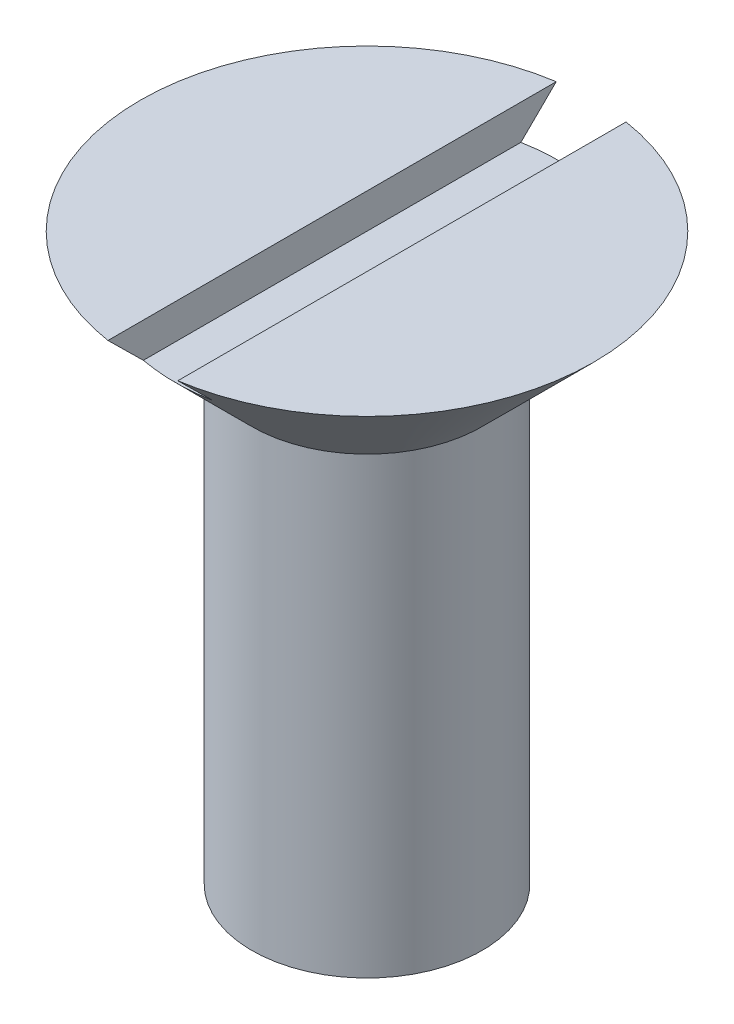
ISO-10303-21;
HEADER;
FILE_DESCRIPTION(('STEP AP214'),'2;1');
FILE_NAME('part.step','',(''),(''),'','','');
FILE_SCHEMA(('AUTOMOTIVE_DESIGN { 1 0 10303 214 1 1 1 1 }'));
ENDSEC;
DATA;
#1=APPLICATION_CONTEXT('core data for automotive mechanical design processes');
#2=APPLICATION_PROTOCOL_DEFINITION('international standard','automotive_design',2000,#1);
#3=PRODUCT_CONTEXT('',#1,'mechanical');
#4=PRODUCT('Part','Part','',(#3));
#5=PRODUCT_RELATED_PRODUCT_CATEGORY('part','',(#4));
#6=PRODUCT_DEFINITION_FORMATION('','',#4);
#7=PRODUCT_DEFINITION_CONTEXT('part definition',#1,'design');
#8=PRODUCT_DEFINITION('design','',#6,#7);
#9=PRODUCT_DEFINITION_SHAPE('','',#8);
#10=(LENGTH_UNIT() NAMED_UNIT(*) SI_UNIT(.MILLI.,.METRE.));
#11=(NAMED_UNIT(*) PLANE_ANGLE_UNIT() SI_UNIT($,.RADIAN.));
#12=(NAMED_UNIT(*) SI_UNIT($,.STERADIAN.) SOLID_ANGLE_UNIT());
#13=UNCERTAINTY_MEASURE_WITH_UNIT(LENGTH_MEASURE(1.E-05),#10,'distance_accuracy_value','');
#14=(GEOMETRIC_REPRESENTATION_CONTEXT(3) GLOBAL_UNCERTAINTY_ASSIGNED_CONTEXT((#13)) GLOBAL_UNIT_ASSIGNED_CONTEXT((#10,
#11,#12)) REPRESENTATION_CONTEXT('',''));
#15=CARTESIAN_POINT('',(0.,0.,0.));
#16=DIRECTION('',(0.,0.,1.));
#17=DIRECTION('',(1.,0.,0.));
#18=AXIS2_PLACEMENT_3D('',#15,#16,#17);
#19=CARTESIAN_POINT('',(-6.5,0.,0.));
#20=DIRECTION('',(0.,1.,0.));
#21=DIRECTION('',(-1.,0.,0.));
#22=AXIS2_PLACEMENT_3D('',#19,#20,#21);
#23=PLANE('',#22);
#24=DIRECTION('',(0.,0.,1.));
#25=VECTOR('',#24,1.);
#26=CARTESIAN_POINT('',(1.,0.,-6.5));
#27=LINE('',#26,#25);
#28=CARTESIAN_POINT('',(1.,0.,-6.42261628933256));
#29=VERTEX_POINT('',#28);
#30=CARTESIAN_POINT('',(1.,0.,6.42261628933256));
#31=VERTEX_POINT('',#30);
#32=EDGE_CURVE('E103',#29,#31,#27,.T.);
#33=ORIENTED_EDGE('',*,*,#32,.T.);
#34=CARTESIAN_POINT('',(0.,0.,0.));
#35=DIRECTION('',(0.,1.,0.));
#36=DIRECTION('',(-1.,0.,0.));
#37=AXIS2_PLACEMENT_3D('',#34,#35,#36);
#38=CIRCLE('',#37,6.5);
#39=EDGE_CURVE('E110',#31,#29,#38,.T.);
#40=ORIENTED_EDGE('',*,*,#39,.T.);
#41=EDGE_LOOP('',(#33,#40));
#42=FACE_BOUND('',#41,.T.);
#43=ADVANCED_FACE('F39',(#42),#23,.T.);
#44=CARTESIAN_POINT('',(0.,0.,0.));
#45=DIRECTION('',(0.,1.,0.));
#46=DIRECTION('',(-1.,0.,0.));
#47=AXIS2_PLACEMENT_3D('',#44,#45,#46);
#48=CYLINDRICAL_SURFACE('',#47,3.30000000000001);
#49=CARTESIAN_POINT('',(0.,-16.2,0.));
#50=DIRECTION('',(0.,1.,0.));
#51=DIRECTION('',(-1.,0.,0.));
#52=AXIS2_PLACEMENT_3D('',#49,#50,#51);
#53=CIRCLE('',#52,3.30000000000001);
#54=CARTESIAN_POINT('',(-3.30000000000001,-16.2,0.));
#55=VERTEX_POINT('',#54);
#56=EDGE_CURVE('E95',#55,#55,#53,.T.);
#57=ORIENTED_EDGE('',*,*,#56,.T.);
#58=EDGE_LOOP('',(#57));
#59=FACE_BOUND('',#58,.T.);
#60=CARTESIAN_POINT('',(0.,-3.2,0.));
#61=DIRECTION('',(0.,1.,0.));
#62=DIRECTION('',(-1.,0.,0.));
#63=AXIS2_PLACEMENT_3D('',#60,#61,#62);
#64=CIRCLE('',#63,3.30000000000001);
#65=CARTESIAN_POINT('',(-3.30000000000001,-3.2,0.));
#66=VERTEX_POINT('',#65);
#67=EDGE_CURVE('E111',#66,#66,#64,.T.);
#68=ORIENTED_EDGE('',*,*,#67,.F.);
#69=EDGE_LOOP('',(#68));
#70=FACE_BOUND('',#69,.T.);
#71=ADVANCED_FACE('F41',(#59,#70),#48,.T.);
#72=CARTESIAN_POINT('',(0.,-16.2,0.));
#73=DIRECTION('',(0.,1.,0.));
#74=DIRECTION('',(-1.,0.,0.));
#75=AXIS2_PLACEMENT_3D('',#72,#73,#74);
#76=CONICAL_SURFACE('',#75,3.30000000000001,1.0471975511966);
#77=CARTESIAN_POINT('',(0.,-18.1052558883257,0.));
#78=VERTEX_POINT('',#77);
#79=VERTEX_LOOP('',#78);
#80=FACE_BOUND('',#79,.T.);
#81=ORIENTED_EDGE('',*,*,#56,.F.);
#82=EDGE_LOOP('',(#81));
#83=FACE_BOUND('',#82,.T.);
#84=ADVANCED_FACE('F148',(#80,#83),#76,.T.);
#85=DIRECTION('',(0.,0.,1.));
#86=VECTOR('',#85,1.);
#87=CARTESIAN_POINT('',(-1.,0.,-6.5));
#88=LINE('',#87,#86);
#89=CARTESIAN_POINT('',(-1.,0.,-6.42261628933256));
#90=VERTEX_POINT('',#89);
#91=CARTESIAN_POINT('',(-1.,0.,6.42261628933256));
#92=VERTEX_POINT('',#91);
#93=EDGE_CURVE('E88',#90,#92,#88,.T.);
#94=ORIENTED_EDGE('',*,*,#93,.F.);
#95=EDGE_CURVE('E101',#90,#92,#38,.T.);
#96=ORIENTED_EDGE('',*,*,#95,.T.);
#97=EDGE_LOOP('',(#94,#96));
#98=FACE_BOUND('',#97,.T.);
#99=ADVANCED_FACE('F100',(#98),#23,.T.);
#100=CARTESIAN_POINT('',(0.,0.,0.));
#101=DIRECTION('',(0.,1.,0.));
#102=DIRECTION('',(-1.,0.,0.));
#103=AXIS2_PLACEMENT_3D('',#100,#101,#102);
#104=CONICAL_SURFACE('',#103,6.5,0.785398163397447);
#105=CARTESIAN_POINT('',(1.,0.000699999999998555,-6.42332472244709));
#106=CARTESIAN_POINT('',(1.,-0.183792492730858,-6.23660097945427));
#107=CARTESIAN_POINT('',(1.,-0.368197265502146,-6.04979042026791));
#108=CARTESIAN_POINT('',(1.,-0.73686733026301,-5.67580075194415));
#109=CARTESIAN_POINT('',(1.,-0.921132462322163,-5.48862148517341));
#110=CARTESIAN_POINT('',(1.,-1.29147888472823,-5.11174427199789));
#111=CARTESIAN_POINT('',(1.,-1.47755623700703,-4.92204245247595));
#112=CARTESIAN_POINT('',(1.,-1.84910847038617,-4.54228085926048));
#113=CARTESIAN_POINT('',(1.,-2.03458365424801,-4.35222138163071));
#114=CARTESIAN_POINT('',(1.,-2.47967422686254,-3.89448779308014));
#115=CARTESIAN_POINT('',(1.,-2.73895793178233,-3.62648996292633));
#116=CARTESIAN_POINT('',(1.,-3.12625588297492,-3.22235847326328));
#117=CARTESIAN_POINT('',(1.,-3.25522556988707,-3.08714155543485));
#118=CARTESIAN_POINT('',(1.,-3.51218350622828,-2.81583986260069));
#119=CARTESIAN_POINT('',(1.,-3.64017198670761,-2.67975530664803));
#120=CARTESIAN_POINT('',(1.,-3.89354332458536,-2.40750996464745));
#121=CARTESIAN_POINT('',(1.,-4.01893932812046,-2.27136147506035));
#122=CARTESIAN_POINT('',(1.,-4.20534855331887,-2.06549251852144));
#123=CARTESIAN_POINT('',(1.,-4.26723322358793,-1.99656195550248));
#124=CARTESIAN_POINT('',(1.,-4.39022064724424,-1.85800765522079));
#125=CARTESIAN_POINT('',(1.,-4.45132341702418,-1.78838393254486));
#126=CARTESIAN_POINT('',(1.,-4.57222497841276,-1.64849944827692));
#127=CARTESIAN_POINT('',(1.,-4.63202802495719,-1.57824237330107));
#128=CARTESIAN_POINT('',(1.,-4.75014951544359,-1.43649465507045));
#129=CARTESIAN_POINT('',(1.,-4.80846810173441,-1.36500413120584));
#130=CARTESIAN_POINT('',(1.,-4.92284314732721,-1.22040224759314));
#131=CARTESIAN_POINT('',(1.,-4.97890283473651,-1.14729345020524));
#132=CARTESIAN_POINT('',(1.,-5.08766859703449,-0.998633654183114));
#133=CARTESIAN_POINT('',(1.,-5.14037670023422,-0.923084175167185));
#134=CARTESIAN_POINT('',(1.,-5.20258630848189,-0.826733268002397));
#135=CARTESIAN_POINT('',(1.,-5.21469371972438,-0.807613449628517));
#136=CARTESIAN_POINT('',(1.,-5.23852006929555,-0.769130032509416));
#137=CARTESIAN_POINT('',(1.,-5.25023895737818,-0.749766402676445));
#138=CARTESIAN_POINT('',(1.,-5.28473413062777,-0.691277443855446));
#139=CARTESIAN_POINT('',(1.,-5.30684764106778,-0.651756012110416));
#140=CARTESIAN_POINT('',(1.,-5.34856731254029,-0.571795836460227));
#141=CARTESIAN_POINT('',(1.,-5.36819205120946,-0.531366913059423));
#142=CARTESIAN_POINT('',(1.,-5.40437851230789,-0.449164527118066));
#143=CARTESIAN_POINT('',(1.,-5.42094116313471,-0.407391476629314));
#144=CARTESIAN_POINT('',(1.,-5.45547408789908,-0.306630339616187));
#145=CARTESIAN_POINT('',(1.,-5.47168567336588,-0.247006700383592));
#146=CARTESIAN_POINT('',(1.,-5.49382871149303,-0.125997310764457));
#147=CARTESIAN_POINT('',(1.,-5.49979783689232,-0.0646188656950337));
#148=CARTESIAN_POINT('',(1.,-5.500192518633,0.0584045004398385));
#149=CARTESIAN_POINT('',(1.,-5.49457591215448,0.120049577222185));
#150=CARTESIAN_POINT('',(1.,-5.47299050567835,0.241594604406581));
#151=CARTESIAN_POINT('',(1.,-5.45698650772999,0.301487895031281));
#152=CARTESIAN_POINT('',(1.,-5.41575455607621,0.423255248595591));
#153=CARTESIAN_POINT('',(1.,-5.38989137923797,0.484904761598879));
#154=CARTESIAN_POINT('',(1.,-5.33222056445678,0.605404375291081));
#155=CARTESIAN_POINT('',(1.,-5.30040153134717,0.66424883375991));
#156=CARTESIAN_POINT('',(1.,-5.23260105967625,0.780076722377034));
#157=CARTESIAN_POINT('',(1.,-5.19658863752789,0.837041711978562));
#158=CARTESIAN_POINT('',(1.,-5.14058479415499,0.921108655798603));
#159=CARTESIAN_POINT('',(1.,-5.12159440728003,0.948889451470521));
#160=CARTESIAN_POINT('',(1.,-5.083051694524,1.00405791508451));
#161=CARTESIAN_POINT('',(1.,-5.06349938486034,1.03144559433801));
#162=CARTESIAN_POINT('',(1.,-5.00047703669951,1.11814350022163));
#163=CARTESIAN_POINT('',(1.,-4.95612701181289,1.17681365371047));
#164=CARTESIAN_POINT('',(1.,-4.86586836876552,1.29294612386852));
#165=CARTESIAN_POINT('',(1.,-4.81995950984232,1.35040825171824));
#166=CARTESIAN_POINT('',(1.,-4.68052305572425,1.52148386035253));
#167=CARTESIAN_POINT('',(1.,-4.58532582897301,1.6337330529775));
#168=CARTESIAN_POINT('',(1.,-4.39226012979681,1.85622604953614));
#169=CARTESIAN_POINT('',(1.,-4.29438727612095,1.96646600221244));
#170=CARTESIAN_POINT('',(1.,-4.09707443457567,2.18547633450562));
#171=CARTESIAN_POINT('',(1.,-3.99763489283881,2.29424711666655));
#172=CARTESIAN_POINT('',(1.,-3.79803149992363,2.51044729255302));
#173=CARTESIAN_POINT('',(1.,-3.69787117348206,2.61787995144471));
#174=CARTESIAN_POINT('',(1.,-3.49680288017973,2.83205668510754));
#175=CARTESIAN_POINT('',(1.,-3.39589486148073,2.93880071115697));
#176=CARTESIAN_POINT('',(1.,-3.09256905568911,3.25807348248407));
#177=CARTESIAN_POINT('',(1.,-2.88935836112697,3.4698481814569));
#178=CARTESIAN_POINT('',(1.,-2.46344877975663,3.9111798086265));
#179=CARTESIAN_POINT('',(1.,-2.24063709954964,4.14062755160491));
#180=CARTESIAN_POINT('',(1.,-1.79406507282806,4.59874114188858));
#181=CARTESIAN_POINT('',(1.,-1.5703044445972,4.82740671438619));
#182=CARTESIAN_POINT('',(1.,-1.12218852408599,5.28420548161042));
#183=CARTESIAN_POINT('',(1.,-0.897833166436106,5.51233861215154));
#184=CARTESIAN_POINT('',(1.,-0.448792076408261,5.96812929258623));
#185=CARTESIAN_POINT('',(1.,-0.224106479587278,6.19578697599764));
#186=CARTESIAN_POINT('',(1.,0.000699999999997812,6.42332472244709));
#187=B_SPLINE_CURVE_WITH_KNOTS('',3,(#105,#106,#107,#108,#109,#110,#111,#112,#113,#114,#115,
#116,#117,#118,#119,#120,#121,#122,#123,#124,#125,#126,#127,#128,#129,#130,#131,#132,#133,#134,
#135,#136,#137,#138,#139,#140,#141,#142,#143,#144,#145,#146,#147,#148,#149,#150,#151,#152,#153,
#154,#155,#156,#157,#158,#159,#160,#161,#162,#163,#164,#165,#166,#167,#168,#169,#170,#171,#172,
#173,#174,#175,#176,#177,#178,#179,#180,#181,#182,#183,#184,#185,#186),.UNSPECIFIED.,.F.,.F.,(4,
2,2,2,2,2,2,2,2,2,2,2,2,2,2,2,2,2,2,2,2,2,2,2,2,2,2,2,2,2,2,2,2,2,2,2,2,2,2,2,4),(0.,
0.78748287909109,1.57545946982073,2.37264371237518,3.16933207457062,4.28800672997833,
4.84858456810997,5.40902607813936,5.96429483881583,6.24219393443101,6.52008719426129,
6.79686319025392,7.07361254470394,7.34995126360952,7.62612112424392,7.69400967717525,
7.7619069758642,7.89770861286132,8.03242799072324,8.1671064556528,8.35176568840787,
8.53574425942205,8.72039354672402,8.90567181282054,9.10576489619662,9.30624479924504,
9.50831322811275,9.60926230610501,9.71020847356945,9.93080591781796,10.1514375897978,
10.5929016423221,11.0351379005564,11.477250424866,11.9178874921872,12.3585554006096,
13.2390498022861,14.1985373102661,15.1583329960948,16.1182389566303,17.0778239415921),.UNSPECIFIED.);
#188=CARTESIAN_POINT('',(1.,-1.,5.40832691319598));
#189=VERTEX_POINT('',#188);
#190=EDGE_CURVE('E11',#189,#31,#187,.T.);
#191=ORIENTED_EDGE('',*,*,#190,.F.);
#192=CARTESIAN_POINT('',(0.,-1.,0.));
#193=DIRECTION('',(0.,-1.,0.));
#194=DIRECTION('',(0.,0.,-1.));
#195=AXIS2_PLACEMENT_3D('',#192,#193,#194);
#196=CIRCLE('',#195,5.5);
#197=CARTESIAN_POINT('',(-1.,-1.,5.40832691319598));
#198=VERTEX_POINT('',#197);
#199=EDGE_CURVE('E55',#198,#189,#196,.F.);
#200=ORIENTED_EDGE('',*,*,#199,.F.);
#201=CARTESIAN_POINT('',(-1.,0.000699999999998392,6.42332472244709));
#202=CARTESIAN_POINT('',(-1.,-0.183792492730857,6.23660097945427));
#203=CARTESIAN_POINT('',(-1.,-0.368197265502144,6.04979042026792));
#204=CARTESIAN_POINT('',(-1.,-0.736867330263007,5.67580075194415));
#205=CARTESIAN_POINT('',(-1.,-0.921132462322159,5.48862148517342));
#206=CARTESIAN_POINT('',(-1.,-1.29147888472822,5.1117442719979));
#207=CARTESIAN_POINT('',(-1.,-1.47755623700703,4.92204245247595));
#208=CARTESIAN_POINT('',(-1.,-1.84910847038616,4.54228085926049));
#209=CARTESIAN_POINT('',(-1.,-2.034583654248,4.35222138163072));
#210=CARTESIAN_POINT('',(-1.,-2.47967422686253,3.89448779308015));
#211=CARTESIAN_POINT('',(-1.,-2.73895793178232,3.62648996292633));
#212=CARTESIAN_POINT('',(-1.,-3.12625588297491,3.22235847326329));
#213=CARTESIAN_POINT('',(-1.,-3.25522556988706,3.08714155543486));
#214=CARTESIAN_POINT('',(-1.,-3.51218350622827,2.8158398626007));
#215=CARTESIAN_POINT('',(-1.,-3.64017198670761,2.67975530664804));
#216=CARTESIAN_POINT('',(-1.,-3.89354332458536,2.40750996464745));
#217=CARTESIAN_POINT('',(-1.,-4.01893932812046,2.27136147506035));
#218=CARTESIAN_POINT('',(-1.,-4.20534855331887,2.06549251852145));
#219=CARTESIAN_POINT('',(-1.,-4.26723322358793,1.99656195550249));
#220=CARTESIAN_POINT('',(-1.,-4.39022064724423,1.85800765522079));
#221=CARTESIAN_POINT('',(-1.,-4.45132341702418,1.78838393254487));
#222=CARTESIAN_POINT('',(-1.,-4.57222497841275,1.64849944827692));
#223=CARTESIAN_POINT('',(-1.,-4.63202802495719,1.57824237330107));
#224=CARTESIAN_POINT('',(-1.,-4.75014951544359,1.43649465507045));
#225=CARTESIAN_POINT('',(-1.,-4.80846810173441,1.36500413120584));
#226=CARTESIAN_POINT('',(-1.,-4.92284314732721,1.22040224759315));
#227=CARTESIAN_POINT('',(-1.,-4.97890283473651,1.14729345020525));
#228=CARTESIAN_POINT('',(-1.,-5.08766859703449,0.998633654183116));
#229=CARTESIAN_POINT('',(-1.,-5.14037670023422,0.923084175167185));
#230=CARTESIAN_POINT('',(-1.,-5.20258630848189,0.826733268002398));
#231=CARTESIAN_POINT('',(-1.,-5.21469371972439,0.807613449628519));
#232=CARTESIAN_POINT('',(-1.,-5.23852006929555,0.769130032509418));
#233=CARTESIAN_POINT('',(-1.,-5.25023895737818,0.749766402676447));
#234=CARTESIAN_POINT('',(-1.,-5.28473413062778,0.691277443855448));
#235=CARTESIAN_POINT('',(-1.,-5.30684764106779,0.651756012110417));
#236=CARTESIAN_POINT('',(-1.,-5.34856731254029,0.571795836460228));
#237=CARTESIAN_POINT('',(-1.,-5.36819205120946,0.531366913059423));
#238=CARTESIAN_POINT('',(-1.,-5.40437851230789,0.449164527118066));
#239=CARTESIAN_POINT('',(-1.,-5.42094116313471,0.407391476629315));
#240=CARTESIAN_POINT('',(-1.,-5.45547408789908,0.306630339616188));
#241=CARTESIAN_POINT('',(-1.,-5.47168567336588,0.247006700383593));
#242=CARTESIAN_POINT('',(-1.,-5.49382871149303,0.125997310764459));
#243=CARTESIAN_POINT('',(-1.,-5.49979783689232,0.0646188656950351));
#244=CARTESIAN_POINT('',(-1.,-5.50019251863301,-0.0584045004398363));
#245=CARTESIAN_POINT('',(-1.,-5.49457591215448,-0.120049577222183));
#246=CARTESIAN_POINT('',(-1.,-5.47299050567835,-0.241594604406578));
#247=CARTESIAN_POINT('',(-1.,-5.45698650773,-0.301487895031279));
#248=CARTESIAN_POINT('',(-1.,-5.41575455607621,-0.423255248595589));
#249=CARTESIAN_POINT('',(-1.,-5.38989137923797,-0.484904761598878));
#250=CARTESIAN_POINT('',(-1.,-5.33222056445678,-0.605404375291079));
#251=CARTESIAN_POINT('',(-1.,-5.30040153134717,-0.664248833759906));
#252=CARTESIAN_POINT('',(-1.,-5.23260105967625,-0.780076722377029));
#253=CARTESIAN_POINT('',(-1.,-5.19658863752789,-0.837041711978557));
#254=CARTESIAN_POINT('',(-1.,-5.140584794155,-0.921108655798597));
#255=CARTESIAN_POINT('',(-1.,-5.12159440728004,-0.948889451470515));
#256=CARTESIAN_POINT('',(-1.,-5.08305169452401,-1.00405791508451));
#257=CARTESIAN_POINT('',(-1.,-5.06349938486035,-1.03144559433801));
#258=CARTESIAN_POINT('',(-1.,-5.00047703669952,-1.11814350022162));
#259=CARTESIAN_POINT('',(-1.,-4.9561270118129,-1.17681365371046));
#260=CARTESIAN_POINT('',(-1.,-4.86586836876553,-1.29294612386851));
#261=CARTESIAN_POINT('',(-1.,-4.81995950984233,-1.35040825171823));
#262=CARTESIAN_POINT('',(-1.,-4.68052305572426,-1.52148386035252));
#263=CARTESIAN_POINT('',(-1.,-4.58532582897302,-1.63373305297749));
#264=CARTESIAN_POINT('',(-1.,-4.39226012979682,-1.85622604953613));
#265=CARTESIAN_POINT('',(-1.,-4.29438727612096,-1.96646600221242));
#266=CARTESIAN_POINT('',(-1.,-4.09707443457568,-2.1854763345056));
#267=CARTESIAN_POINT('',(-1.,-3.99763489283883,-2.29424711666653));
#268=CARTESIAN_POINT('',(-1.,-3.79803149992365,-2.51044729255301));
#269=CARTESIAN_POINT('',(-1.,-3.69787117348208,-2.61787995144469));
#270=CARTESIAN_POINT('',(-1.,-3.49680288017975,-2.83205668510752));
#271=CARTESIAN_POINT('',(-1.,-3.39589486148075,-2.93880071115695));
#272=CARTESIAN_POINT('',(-1.,-3.09256905568914,-3.25807348248404));
#273=CARTESIAN_POINT('',(-1.,-2.889358361127,-3.46984818145688));
#274=CARTESIAN_POINT('',(-1.,-2.46344877975666,-3.91117980862647));
#275=CARTESIAN_POINT('',(-1.,-2.24063709954967,-4.14062755160489));
#276=CARTESIAN_POINT('',(-1.,-1.79406507282808,-4.59874114188856));
#277=CARTESIAN_POINT('',(-1.,-1.57030444459722,-4.82740671438617));
#278=CARTESIAN_POINT('',(-1.,-1.122188524086,-5.2842054816104));
#279=CARTESIAN_POINT('',(-1.,-0.897833166436116,-5.51233861215153));
#280=CARTESIAN_POINT('',(-1.,-0.448792076408267,-5.96812929258622));
#281=CARTESIAN_POINT('',(-1.,-0.224106479587282,-6.19578697599764));
#282=CARTESIAN_POINT('',(-1.,0.000699999999997716,-6.42332472244709));
#283=B_SPLINE_CURVE_WITH_KNOTS('',3,(#201,#202,#203,#204,#205,#206,#207,#208,#209,#210,#211,
#212,#213,#214,#215,#216,#217,#218,#219,#220,#221,#222,#223,#224,#225,#226,#227,#228,#229,#230,
#231,#232,#233,#234,#235,#236,#237,#238,#239,#240,#241,#242,#243,#244,#245,#246,#247,#248,#249,
#250,#251,#252,#253,#254,#255,#256,#257,#258,#259,#260,#261,#262,#263,#264,#265,#266,#267,#268,
#269,#270,#271,#272,#273,#274,#275,#276,#277,#278,#279,#280,#281,#282),.UNSPECIFIED.,.F.,.F.,(4,
2,2,2,2,2,2,2,2,2,2,2,2,2,2,2,2,2,2,2,2,2,2,2,2,2,2,2,2,2,2,2,2,2,2,2,2,2,2,2,4),(0.,
0.787482879091085,1.57545946982073,2.37264371237517,3.16933207457061,4.28800672997832,
4.84858456810996,5.40902607813935,5.96429483881582,6.24219393443101,6.52008719426129,
6.79686319025391,7.07361254470394,7.34995126360952,7.62612112424392,7.69400967717524,
7.7619069758642,7.89770861286132,8.03242799072324,8.1671064556528,8.35176568840787,
8.53574425942205,8.72039354672401,8.90567181282054,9.10576489619662,9.30624479924503,
9.50831322811275,9.60926230610501,9.71020847356944,9.93080591781795,10.1514375897977,
10.5929016423221,11.0351379005564,11.477250424866,11.9178874921871,12.3585554006095,
13.2390498022861,14.1985373102661,15.1583329960948,16.1182389566303,17.0778239415921),.UNSPECIFIED.);
#284=EDGE_CURVE('E97',#92,#198,#283,.T.);
#285=ORIENTED_EDGE('',*,*,#284,.F.);
#286=ORIENTED_EDGE('',*,*,#95,.F.);
#287=CARTESIAN_POINT('',(-1.,-1.,-5.40832691319599));
#288=VERTEX_POINT('',#287);
#289=EDGE_CURVE('E85',#288,#90,#283,.T.);
#290=ORIENTED_EDGE('',*,*,#289,.F.);
#291=CARTESIAN_POINT('',(1.,-1.,-5.40832691319599));
#292=VERTEX_POINT('',#291);
#293=EDGE_CURVE('E94',#292,#288,#196,.F.);
#294=ORIENTED_EDGE('',*,*,#293,.F.);
#295=EDGE_CURVE('E43',#29,#292,#187,.T.);
#296=ORIENTED_EDGE('',*,*,#295,.F.);
#297=ORIENTED_EDGE('',*,*,#39,.F.);
#298=EDGE_LOOP('',(#191,#200,#285,#286,#290,#294,#296,#297));
#299=FACE_BOUND('',#298,.T.);
#300=ORIENTED_EDGE('',*,*,#67,.T.);
#301=EDGE_LOOP('',(#300));
#302=FACE_BOUND('',#301,.T.);
#303=ADVANCED_FACE('F106',(#299,#302),#104,.T.);
#304=CARTESIAN_POINT('',(1.,0.,-6.5));
#305=DIRECTION('',(1.,0.,0.));
#306=DIRECTION('',(0.,1.,0.));
#307=AXIS2_PLACEMENT_3D('',#304,#305,#306);
#308=PLANE('',#307);
#309=ORIENTED_EDGE('',*,*,#295,.T.);
#310=DIRECTION('',(0.,0.,1.));
#311=VECTOR('',#310,1.);
#312=CARTESIAN_POINT('',(1.,-1.,-6.5));
#313=LINE('',#312,#311);
#314=EDGE_CURVE('E117',#292,#189,#313,.T.);
#315=ORIENTED_EDGE('',*,*,#314,.T.);
#316=ORIENTED_EDGE('',*,*,#190,.T.);
#317=ORIENTED_EDGE('',*,*,#32,.F.);
#318=EDGE_LOOP('',(#309,#315,#316,#317));
#319=FACE_BOUND('',#318,.T.);
#320=ADVANCED_FACE('F134',(#319),#308,.F.);
#321=CARTESIAN_POINT('',(-1.,-1.,-6.5));
#322=DIRECTION('',(0.,-1.,0.));
#323=DIRECTION('',(0.,0.,-1.));
#324=AXIS2_PLACEMENT_3D('',#321,#322,#323);
#325=PLANE('',#324);
#326=ORIENTED_EDGE('',*,*,#199,.T.);
#327=ORIENTED_EDGE('',*,*,#314,.F.);
#328=ORIENTED_EDGE('',*,*,#293,.T.);
#329=DIRECTION('',(0.,0.,1.));
#330=VECTOR('',#329,1.);
#331=CARTESIAN_POINT('',(-1.,-1.,-6.5));
#332=LINE('',#331,#330);
#333=EDGE_CURVE('E62',#288,#198,#332,.T.);
#334=ORIENTED_EDGE('',*,*,#333,.T.);
#335=EDGE_LOOP('',(#326,#327,#328,#334));
#336=FACE_BOUND('',#335,.T.);
#337=ADVANCED_FACE('F133',(#336),#325,.F.);
#338=CARTESIAN_POINT('',(-1.,0.,-6.5));
#339=DIRECTION('',(-1.,0.,0.));
#340=DIRECTION('',(0.,0.,1.));
#341=AXIS2_PLACEMENT_3D('',#338,#339,#340);
#342=PLANE('',#341);
#343=ORIENTED_EDGE('',*,*,#284,.T.);
#344=ORIENTED_EDGE('',*,*,#333,.F.);
#345=ORIENTED_EDGE('',*,*,#289,.T.);
#346=ORIENTED_EDGE('',*,*,#93,.T.);
#347=EDGE_LOOP('',(#343,#344,#345,#346));
#348=FACE_BOUND('',#347,.T.);
#349=ADVANCED_FACE('F87',(#348),#342,.F.);
#350=CLOSED_SHELL('',(#43,#71,#84,#99,#303,#320,#337,#349));
#351=MANIFOLD_SOLID_BREP('B2',#350);
#352=ADVANCED_BREP_SHAPE_REPRESENTATION('',(#18,#351),#14);
#353=SHAPE_DEFINITION_REPRESENTATION(#9,#352);
ENDSEC;
END-ISO-10303-21;
